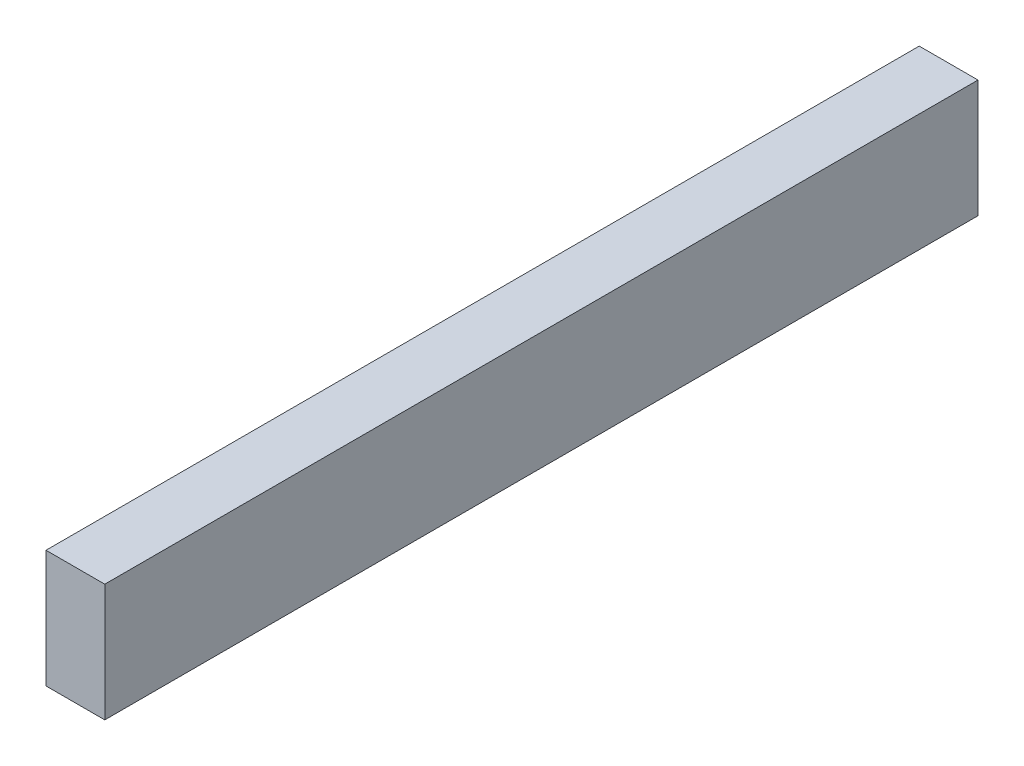
ISO-10303-21;
HEADER;
FILE_DESCRIPTION(('STEP AP214'),'2;1');
FILE_NAME('part.step','',(''),(''),'','','');
FILE_SCHEMA(('AUTOMOTIVE_DESIGN { 1 0 10303 214 1 1 1 1 }'));
ENDSEC;
DATA;
#1=APPLICATION_CONTEXT('core data for automotive mechanical design processes');
#2=APPLICATION_PROTOCOL_DEFINITION('international standard','automotive_design',2000,#1);
#3=PRODUCT_CONTEXT('',#1,'mechanical');
#4=PRODUCT('Part','Part','',(#3));
#5=PRODUCT_RELATED_PRODUCT_CATEGORY('part','',(#4));
#6=PRODUCT_DEFINITION_FORMATION('','',#4);
#7=PRODUCT_DEFINITION_CONTEXT('part definition',#1,'design');
#8=PRODUCT_DEFINITION('design','',#6,#7);
#9=PRODUCT_DEFINITION_SHAPE('','',#8);
#10=(LENGTH_UNIT() NAMED_UNIT(*) SI_UNIT(.MILLI.,.METRE.));
#11=(NAMED_UNIT(*) PLANE_ANGLE_UNIT() SI_UNIT($,.RADIAN.));
#12=(NAMED_UNIT(*) SI_UNIT($,.STERADIAN.) SOLID_ANGLE_UNIT());
#13=UNCERTAINTY_MEASURE_WITH_UNIT(LENGTH_MEASURE(1.E-05),#10,'distance_accuracy_value','');
#14=(GEOMETRIC_REPRESENTATION_CONTEXT(3) GLOBAL_UNCERTAINTY_ASSIGNED_CONTEXT((#13)) GLOBAL_UNIT_ASSIGNED_CONTEXT((#10,
#11,#12)) REPRESENTATION_CONTEXT('',''));
#15=CARTESIAN_POINT('',(0.,0.,0.));
#16=DIRECTION('',(0.,0.,1.));
#17=DIRECTION('',(1.,0.,0.));
#18=AXIS2_PLACEMENT_3D('',#15,#16,#17);
#19=CARTESIAN_POINT('',(0.,0.,330.2));
#20=DIRECTION('',(1.,0.,0.));
#21=DIRECTION('',(0.,0.,-1.));
#22=AXIS2_PLACEMENT_3D('',#19,#20,#21);
#23=PLANE('',#22);
#24=DIRECTION('',(0.,-1.,0.));
#25=VECTOR('',#24,1.);
#26=CARTESIAN_POINT('',(0.,0.,0.));
#27=LINE('',#26,#25);
#28=CARTESIAN_POINT('',(0.,44.45,0.));
#29=VERTEX_POINT('',#28);
#30=CARTESIAN_POINT('',(0.,0.,0.));
#31=VERTEX_POINT('',#30);
#32=EDGE_CURVE('E96',#29,#31,#27,.T.);
#33=ORIENTED_EDGE('',*,*,#32,.T.);
#34=DIRECTION('',(0.,0.,-1.));
#35=VECTOR('',#34,1.);
#36=CARTESIAN_POINT('',(0.,0.,330.2));
#37=LINE('',#36,#35);
#38=CARTESIAN_POINT('',(0.,0.,330.2));
#39=VERTEX_POINT('',#38);
#40=EDGE_CURVE('E11',#39,#31,#37,.T.);
#41=ORIENTED_EDGE('',*,*,#40,.F.);
#42=DIRECTION('',(0.,-1.,0.));
#43=VECTOR('',#42,1.);
#44=CARTESIAN_POINT('',(0.,0.,330.2));
#45=LINE('',#44,#43);
#46=CARTESIAN_POINT('',(0.,44.45,330.2));
#47=VERTEX_POINT('',#46);
#48=EDGE_CURVE('E84',#47,#39,#45,.T.);
#49=ORIENTED_EDGE('',*,*,#48,.F.);
#50=DIRECTION('',(0.,0.,-1.));
#51=VECTOR('',#50,1.);
#52=CARTESIAN_POINT('',(0.,44.45,330.2));
#53=LINE('',#52,#51);
#54=EDGE_CURVE('E92',#47,#29,#53,.T.);
#55=ORIENTED_EDGE('',*,*,#54,.T.);
#56=EDGE_LOOP('',(#33,#41,#49,#55));
#57=FACE_BOUND('',#56,.T.);
#58=ADVANCED_FACE('F33',(#57),#23,.F.);
#59=CARTESIAN_POINT('',(0.,0.,330.2));
#60=DIRECTION('',(0.,1.,0.));
#61=DIRECTION('',(0.,0.,1.));
#62=AXIS2_PLACEMENT_3D('',#59,#60,#61);
#63=PLANE('',#62);
#64=DIRECTION('',(1.,0.,0.));
#65=VECTOR('',#64,1.);
#66=CARTESIAN_POINT('',(0.,0.,0.));
#67=LINE('',#66,#65);
#68=CARTESIAN_POINT('',(22.225,0.,0.));
#69=VERTEX_POINT('',#68);
#70=EDGE_CURVE('E88',#31,#69,#67,.T.);
#71=ORIENTED_EDGE('',*,*,#70,.T.);
#72=DIRECTION('',(0.,0.,-1.));
#73=VECTOR('',#72,1.);
#74=CARTESIAN_POINT('',(22.225,0.,330.2));
#75=LINE('',#74,#73);
#76=CARTESIAN_POINT('',(22.225,0.,330.2));
#77=VERTEX_POINT('',#76);
#78=EDGE_CURVE('E41',#77,#69,#75,.T.);
#79=ORIENTED_EDGE('',*,*,#78,.F.);
#80=DIRECTION('',(1.,0.,0.));
#81=VECTOR('',#80,1.);
#82=CARTESIAN_POINT('',(0.,0.,330.2));
#83=LINE('',#82,#81);
#84=EDGE_CURVE('E79',#39,#77,#83,.T.);
#85=ORIENTED_EDGE('',*,*,#84,.F.);
#86=ORIENTED_EDGE('',*,*,#40,.T.);
#87=EDGE_LOOP('',(#71,#79,#85,#86));
#88=FACE_BOUND('',#87,.T.);
#89=ADVANCED_FACE('F87',(#88),#63,.F.);
#90=CARTESIAN_POINT('',(22.225,0.,330.2));
#91=DIRECTION('',(-1.,0.,0.));
#92=DIRECTION('',(0.,0.,1.));
#93=AXIS2_PLACEMENT_3D('',#90,#91,#92);
#94=PLANE('',#93);
#95=DIRECTION('',(0.,1.,0.));
#96=VECTOR('',#95,1.);
#97=CARTESIAN_POINT('',(22.225,0.,0.));
#98=LINE('',#97,#96);
#99=CARTESIAN_POINT('',(22.225,44.45,0.));
#100=VERTEX_POINT('',#99);
#101=EDGE_CURVE('E66',#69,#100,#98,.T.);
#102=ORIENTED_EDGE('',*,*,#101,.T.);
#103=DIRECTION('',(0.,0.,-1.));
#104=VECTOR('',#103,1.);
#105=CARTESIAN_POINT('',(22.225,44.45,330.2));
#106=LINE('',#105,#104);
#107=CARTESIAN_POINT('',(22.225,44.45,330.2));
#108=VERTEX_POINT('',#107);
#109=EDGE_CURVE('E89',#108,#100,#106,.T.);
#110=ORIENTED_EDGE('',*,*,#109,.F.);
#111=DIRECTION('',(0.,1.,0.));
#112=VECTOR('',#111,1.);
#113=CARTESIAN_POINT('',(22.225,0.,330.2));
#114=LINE('',#113,#112);
#115=EDGE_CURVE('E82',#77,#108,#114,.T.);
#116=ORIENTED_EDGE('',*,*,#115,.F.);
#117=ORIENTED_EDGE('',*,*,#78,.T.);
#118=EDGE_LOOP('',(#102,#110,#116,#117));
#119=FACE_BOUND('',#118,.T.);
#120=ADVANCED_FACE('F90',(#119),#94,.F.);
#121=CARTESIAN_POINT('',(0.,44.45,330.2));
#122=DIRECTION('',(0.,-1.,0.));
#123=DIRECTION('',(0.,0.,-1.));
#124=AXIS2_PLACEMENT_3D('',#121,#122,#123);
#125=PLANE('',#124);
#126=DIRECTION('',(-1.,0.,0.));
#127=VECTOR('',#126,1.);
#128=CARTESIAN_POINT('',(0.,44.45,0.));
#129=LINE('',#128,#127);
#130=EDGE_CURVE('E72',#100,#29,#129,.T.);
#131=ORIENTED_EDGE('',*,*,#130,.T.);
#132=ORIENTED_EDGE('',*,*,#54,.F.);
#133=DIRECTION('',(-1.,0.,0.));
#134=VECTOR('',#133,1.);
#135=CARTESIAN_POINT('',(0.,44.45,330.2));
#136=LINE('',#135,#134);
#137=EDGE_CURVE('E49',#108,#47,#136,.T.);
#138=ORIENTED_EDGE('',*,*,#137,.F.);
#139=ORIENTED_EDGE('',*,*,#109,.T.);
#140=EDGE_LOOP('',(#131,#132,#138,#139));
#141=FACE_BOUND('',#140,.T.);
#142=ADVANCED_FACE('F103',(#141),#125,.F.);
#143=CARTESIAN_POINT('',(0.,0.,330.2));
#144=DIRECTION('',(0.,0.,-1.));
#145=DIRECTION('',(-1.,0.,0.));
#146=AXIS2_PLACEMENT_3D('',#143,#144,#145);
#147=PLANE('',#146);
#148=ORIENTED_EDGE('',*,*,#48,.T.);
#149=ORIENTED_EDGE('',*,*,#84,.T.);
#150=ORIENTED_EDGE('',*,*,#115,.T.);
#151=ORIENTED_EDGE('',*,*,#137,.T.);
#152=EDGE_LOOP('',(#148,#149,#150,#151));
#153=FACE_BOUND('',#152,.T.);
#154=ADVANCED_FACE('F80',(#153),#147,.F.);
#155=CARTESIAN_POINT('',(0.,0.,0.));
#156=DIRECTION('',(0.,0.,-1.));
#157=DIRECTION('',(-1.,0.,0.));
#158=AXIS2_PLACEMENT_3D('',#155,#156,#157);
#159=PLANE('',#158);
#160=ORIENTED_EDGE('',*,*,#32,.F.);
#161=ORIENTED_EDGE('',*,*,#130,.F.);
#162=ORIENTED_EDGE('',*,*,#101,.F.);
#163=ORIENTED_EDGE('',*,*,#70,.F.);
#164=EDGE_LOOP('',(#160,#161,#162,#163));
#165=FACE_BOUND('',#164,.T.);
#166=ADVANCED_FACE('F106',(#165),#159,.T.);
#167=CLOSED_SHELL('',(#58,#89,#120,#142,#154,#166));
#168=MANIFOLD_SOLID_BREP('B2',#167);
#169=ADVANCED_BREP_SHAPE_REPRESENTATION('',(#18,#168),#14);
#170=SHAPE_DEFINITION_REPRESENTATION(#9,#169);
ENDSEC;
END-ISO-10303-21;
